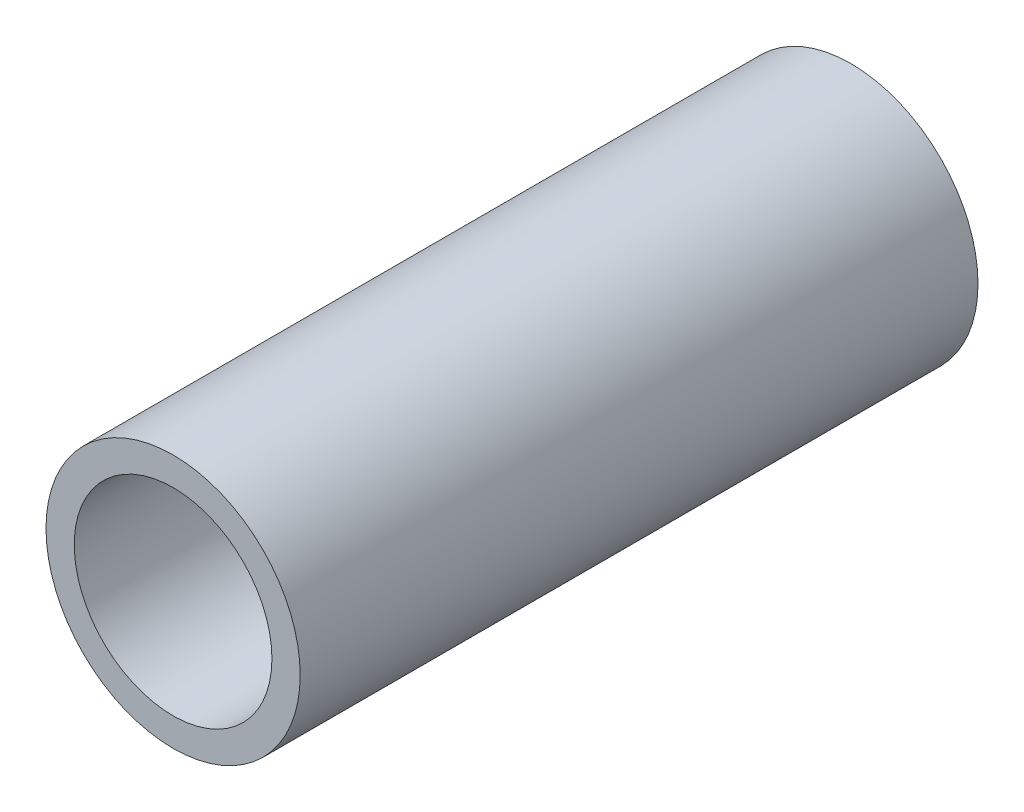
ISO-10303-21;
HEADER;
FILE_DESCRIPTION(('STEP AP214'),'2;1');
FILE_NAME('part.step','',(''),(''),'','','');
FILE_SCHEMA(('AUTOMOTIVE_DESIGN { 1 0 10303 214 1 1 1 1 }'));
ENDSEC;
DATA;
#1=APPLICATION_CONTEXT('core data for automotive mechanical design processes');
#2=APPLICATION_PROTOCOL_DEFINITION('international standard','automotive_design',2000,#1);
#3=PRODUCT_CONTEXT('',#1,'mechanical');
#4=PRODUCT('Part','Part','',(#3));
#5=PRODUCT_RELATED_PRODUCT_CATEGORY('part','',(#4));
#6=PRODUCT_DEFINITION_FORMATION('','',#4);
#7=PRODUCT_DEFINITION_CONTEXT('part definition',#1,'design');
#8=PRODUCT_DEFINITION('design','',#6,#7);
#9=PRODUCT_DEFINITION_SHAPE('','',#8);
#10=(LENGTH_UNIT() NAMED_UNIT(*) SI_UNIT(.MILLI.,.METRE.));
#11=(NAMED_UNIT(*) PLANE_ANGLE_UNIT() SI_UNIT($,.RADIAN.));
#12=(NAMED_UNIT(*) SI_UNIT($,.STERADIAN.) SOLID_ANGLE_UNIT());
#13=UNCERTAINTY_MEASURE_WITH_UNIT(LENGTH_MEASURE(1.E-05),#10,'distance_accuracy_value','');
#14=(GEOMETRIC_REPRESENTATION_CONTEXT(3) GLOBAL_UNCERTAINTY_ASSIGNED_CONTEXT((#13)) GLOBAL_UNIT_ASSIGNED_CONTEXT((#10,
#11,#12)) REPRESENTATION_CONTEXT('',''));
#15=CARTESIAN_POINT('',(0.,0.,0.));
#16=DIRECTION('',(0.,0.,1.));
#17=DIRECTION('',(1.,0.,0.));
#18=AXIS2_PLACEMENT_3D('',#15,#16,#17);
#19=CARTESIAN_POINT('',(0.,0.,48.));
#20=DIRECTION('',(0.,0.,1.));
#21=DIRECTION('',(1.,0.,0.));
#22=AXIS2_PLACEMENT_3D('',#19,#20,#21);
#23=PLANE('',#22);
#24=CARTESIAN_POINT('',(0.,0.,48.));
#25=DIRECTION('',(0.,0.,1.));
#26=DIRECTION('',(1.,0.,0.));
#27=AXIS2_PLACEMENT_3D('',#24,#25,#26);
#28=CIRCLE('',#27,9.);
#29=CARTESIAN_POINT('',(9.,0.,48.));
#30=VERTEX_POINT('',#29);
#31=EDGE_CURVE('E10',#30,#30,#28,.T.);
#32=ORIENTED_EDGE('',*,*,#31,.T.);
#33=EDGE_LOOP('',(#32));
#34=FACE_BOUND('',#33,.T.);
#35=CARTESIAN_POINT('',(0.,0.,48.));
#36=DIRECTION('',(0.,0.,1.));
#37=DIRECTION('',(1.,0.,0.));
#38=AXIS2_PLACEMENT_3D('',#35,#36,#37);
#39=CIRCLE('',#38,7.);
#40=CARTESIAN_POINT('',(7.,0.,48.));
#41=VERTEX_POINT('',#40);
#42=EDGE_CURVE('E50',#41,#41,#39,.T.);
#43=ORIENTED_EDGE('',*,*,#42,.F.);
#44=EDGE_LOOP('',(#43));
#45=FACE_BOUND('',#44,.T.);
#46=ADVANCED_FACE('F37',(#34,#45),#23,.T.);
#47=CARTESIAN_POINT('',(0.,0.,0.));
#48=DIRECTION('',(0.,0.,1.));
#49=DIRECTION('',(1.,0.,0.));
#50=AXIS2_PLACEMENT_3D('',#47,#48,#49);
#51=PLANE('',#50);
#52=CARTESIAN_POINT('',(0.,0.,0.));
#53=DIRECTION('',(0.,0.,1.));
#54=DIRECTION('',(1.,0.,0.));
#55=AXIS2_PLACEMENT_3D('',#52,#53,#54);
#56=CIRCLE('',#55,9.);
#57=CARTESIAN_POINT('',(9.,0.,0.));
#58=VERTEX_POINT('',#57);
#59=EDGE_CURVE('E41',#58,#58,#56,.T.);
#60=ORIENTED_EDGE('',*,*,#59,.F.);
#61=EDGE_LOOP('',(#60));
#62=FACE_BOUND('',#61,.T.);
#63=CARTESIAN_POINT('',(0.,0.,0.));
#64=DIRECTION('',(0.,0.,1.));
#65=DIRECTION('',(1.,0.,0.));
#66=AXIS2_PLACEMENT_3D('',#63,#64,#65);
#67=CIRCLE('',#66,7.);
#68=CARTESIAN_POINT('',(7.,0.,0.));
#69=VERTEX_POINT('',#68);
#70=EDGE_CURVE('E52',#69,#69,#67,.T.);
#71=ORIENTED_EDGE('',*,*,#70,.T.);
#72=EDGE_LOOP('',(#71));
#73=FACE_BOUND('',#72,.T.);
#74=ADVANCED_FACE('F64',(#62,#73),#51,.F.);
#75=CARTESIAN_POINT('',(0.,0.,48.));
#76=DIRECTION('',(0.,0.,-1.));
#77=DIRECTION('',(-1.,0.,0.));
#78=AXIS2_PLACEMENT_3D('',#75,#76,#77);
#79=CYLINDRICAL_SURFACE('',#78,9.);
#80=ORIENTED_EDGE('',*,*,#31,.F.);
#81=EDGE_LOOP('',(#80));
#82=FACE_BOUND('',#81,.T.);
#83=ORIENTED_EDGE('',*,*,#59,.T.);
#84=EDGE_LOOP('',(#83));
#85=FACE_BOUND('',#84,.T.);
#86=ADVANCED_FACE('F39',(#82,#85),#79,.T.);
#87=CARTESIAN_POINT('',(0.,0.,48.));
#88=DIRECTION('',(0.,0.,-1.));
#89=DIRECTION('',(-1.,0.,0.));
#90=AXIS2_PLACEMENT_3D('',#87,#88,#89);
#91=CYLINDRICAL_SURFACE('',#90,7.);
#92=ORIENTED_EDGE('',*,*,#42,.T.);
#93=EDGE_LOOP('',(#92));
#94=FACE_BOUND('',#93,.T.);
#95=ORIENTED_EDGE('',*,*,#70,.F.);
#96=EDGE_LOOP('',(#95));
#97=FACE_BOUND('',#96,.T.);
#98=ADVANCED_FACE('F60',(#94,#97),#91,.F.);
#99=CLOSED_SHELL('',(#46,#74,#86,#98));
#100=MANIFOLD_SOLID_BREP('B2',#99);
#101=ADVANCED_BREP_SHAPE_REPRESENTATION('',(#18,#100),#14);
#102=SHAPE_DEFINITION_REPRESENTATION(#9,#101);
ENDSEC;
END-ISO-10303-21;
